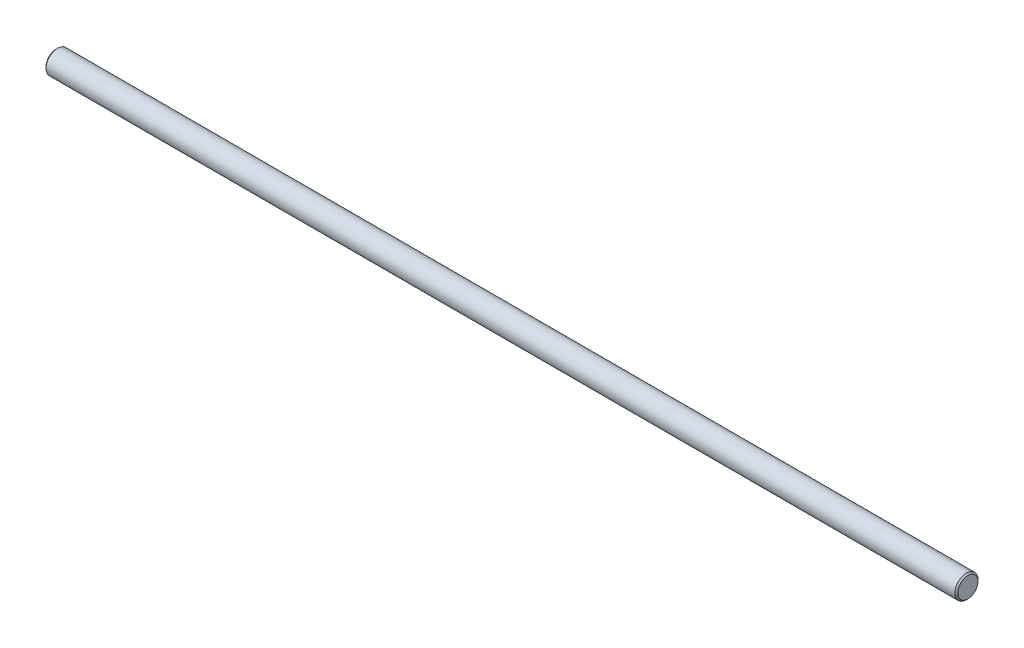
ISO-10303-21;
HEADER;
FILE_DESCRIPTION(('STEP AP214'),'2;1');
FILE_NAME('part.step','',(''),(''),'','','');
FILE_SCHEMA(('AUTOMOTIVE_DESIGN { 1 0 10303 214 1 1 1 1 }'));
ENDSEC;
DATA;
#1=APPLICATION_CONTEXT('core data for automotive mechanical design processes');
#2=APPLICATION_PROTOCOL_DEFINITION('international standard','automotive_design',2000,#1);
#3=PRODUCT_CONTEXT('',#1,'mechanical');
#4=PRODUCT('Part','Part','',(#3));
#5=PRODUCT_RELATED_PRODUCT_CATEGORY('part','',(#4));
#6=PRODUCT_DEFINITION_FORMATION('','',#4);
#7=PRODUCT_DEFINITION_CONTEXT('part definition',#1,'design');
#8=PRODUCT_DEFINITION('design','',#6,#7);
#9=PRODUCT_DEFINITION_SHAPE('','',#8);
#10=(LENGTH_UNIT() NAMED_UNIT(*) SI_UNIT(.MILLI.,.METRE.));
#11=(NAMED_UNIT(*) PLANE_ANGLE_UNIT() SI_UNIT($,.RADIAN.));
#12=(NAMED_UNIT(*) SI_UNIT($,.STERADIAN.) SOLID_ANGLE_UNIT());
#13=UNCERTAINTY_MEASURE_WITH_UNIT(LENGTH_MEASURE(1.E-05),#10,'distance_accuracy_value','');
#14=(GEOMETRIC_REPRESENTATION_CONTEXT(3) GLOBAL_UNCERTAINTY_ASSIGNED_CONTEXT((#13)) GLOBAL_UNIT_ASSIGNED_CONTEXT((#10,
#11,#12)) REPRESENTATION_CONTEXT('',''));
#15=CARTESIAN_POINT('',(0.,0.,0.));
#16=DIRECTION('',(0.,0.,1.));
#17=DIRECTION('',(1.,0.,0.));
#18=AXIS2_PLACEMENT_3D('',#15,#16,#17);
#19=CARTESIAN_POINT('',(0.50000000001296,0.,0.));
#20=DIRECTION('',(1.,0.,0.));
#21=DIRECTION('',(0.,0.,-1.));
#22=AXIS2_PLACEMENT_3D('',#19,#20,#21);
#23=CONICAL_SURFACE('',#22,3.99999999998704,0.785398163397449);
#24=CARTESIAN_POINT('',(0.,0.,0.));
#25=DIRECTION('',(1.,0.,0.));
#26=DIRECTION('',(0.,0.,-1.));
#27=AXIS2_PLACEMENT_3D('',#24,#25,#26);
#28=CIRCLE('',#27,3.49999999997408);
#29=CARTESIAN_POINT('',(0.,0.,-3.49999999997408));
#30=VERTEX_POINT('',#29);
#31=EDGE_CURVE('E49',#30,#30,#28,.T.);
#32=ORIENTED_EDGE('',*,*,#31,.T.);
#33=EDGE_LOOP('',(#32));
#34=FACE_BOUND('',#33,.T.);
#35=CARTESIAN_POINT('',(0.50000000001296,0.,0.));
#36=DIRECTION('',(1.,0.,0.));
#37=DIRECTION('',(0.,0.,-1.));
#38=AXIS2_PLACEMENT_3D('',#35,#36,#37);
#39=CIRCLE('',#38,3.99999999998704);
#40=CARTESIAN_POINT('',(0.50000000001296,0.,-3.99999999998704));
#41=VERTEX_POINT('',#40);
#42=EDGE_CURVE('E10',#41,#41,#39,.T.);
#43=ORIENTED_EDGE('',*,*,#42,.F.);
#44=EDGE_LOOP('',(#43));
#45=FACE_BOUND('',#44,.T.);
#46=ADVANCED_FACE('F35',(#34,#45),#23,.T.);
#47=CARTESIAN_POINT('',(0.,0.,0.));
#48=DIRECTION('',(1.,0.,0.));
#49=DIRECTION('',(0.,0.,-1.));
#50=AXIS2_PLACEMENT_3D('',#47,#48,#49);
#51=CYLINDRICAL_SURFACE('',#50,3.99999999998706);
#52=ORIENTED_EDGE('',*,*,#42,.T.);
#53=EDGE_LOOP('',(#52));
#54=FACE_BOUND('',#53,.T.);
#55=CARTESIAN_POINT('',(314.500000000013,0.,0.));
#56=DIRECTION('',(1.,0.,0.));
#57=DIRECTION('',(0.,0.,-1.));
#58=AXIS2_PLACEMENT_3D('',#55,#56,#57);
#59=CIRCLE('',#58,3.99999999998708);
#60=CARTESIAN_POINT('',(314.500000000013,0.,-3.99999999998708));
#61=VERTEX_POINT('',#60);
#62=EDGE_CURVE('E41',#61,#61,#59,.T.);
#63=ORIENTED_EDGE('',*,*,#62,.F.);
#64=EDGE_LOOP('',(#63));
#65=FACE_BOUND('',#64,.T.);
#66=ADVANCED_FACE('F68',(#54,#65),#51,.T.);
#67=CARTESIAN_POINT('',(315.000000000053,0.,0.));
#68=DIRECTION('',(-1.,0.,0.));
#69=DIRECTION('',(0.,0.,1.));
#70=AXIS2_PLACEMENT_3D('',#67,#68,#69);
#71=CONICAL_SURFACE('',#70,3.49999999994685,0.785398163397434);
#72=ORIENTED_EDGE('',*,*,#62,.T.);
#73=EDGE_LOOP('',(#72));
#74=FACE_BOUND('',#73,.T.);
#75=CARTESIAN_POINT('',(315.000000000053,0.,0.));
#76=DIRECTION('',(1.,0.,0.));
#77=DIRECTION('',(0.,0.,-1.));
#78=AXIS2_PLACEMENT_3D('',#75,#76,#77);
#79=CIRCLE('',#78,3.49999999994685);
#80=CARTESIAN_POINT('',(315.000000000053,0.,-3.49999999994685));
#81=VERTEX_POINT('',#80);
#82=EDGE_CURVE('E45',#81,#81,#79,.T.);
#83=ORIENTED_EDGE('',*,*,#82,.F.);
#84=EDGE_LOOP('',(#83));
#85=FACE_BOUND('',#84,.T.);
#86=ADVANCED_FACE('F64',(#74,#85),#71,.T.);
#87=CARTESIAN_POINT('',(315.000000000053,0.,0.));
#88=DIRECTION('',(1.,0.,0.));
#89=DIRECTION('',(0.,0.,-1.));
#90=AXIS2_PLACEMENT_3D('',#87,#88,#89);
#91=PLANE('',#90);
#92=ORIENTED_EDGE('',*,*,#82,.T.);
#93=EDGE_LOOP('',(#92));
#94=FACE_BOUND('',#93,.T.);
#95=ADVANCED_FACE('F59',(#94),#91,.T.);
#96=CARTESIAN_POINT('',(0.,3.49999999997408,0.));
#97=DIRECTION('',(-1.,0.,0.));
#98=DIRECTION('',(0.,0.,1.));
#99=AXIS2_PLACEMENT_3D('',#96,#97,#98);
#100=PLANE('',#99);
#101=ORIENTED_EDGE('',*,*,#31,.F.);
#102=EDGE_LOOP('',(#101));
#103=FACE_BOUND('',#102,.T.);
#104=ADVANCED_FACE('F57',(#103),#100,.T.);
#105=CLOSED_SHELL('',(#46,#66,#86,#95,#104));
#106=MANIFOLD_SOLID_BREP('B2',#105);
#107=ADVANCED_BREP_SHAPE_REPRESENTATION('',(#18,#106),#14);
#108=SHAPE_DEFINITION_REPRESENTATION(#9,#107);
ENDSEC;
END-ISO-10303-21;
